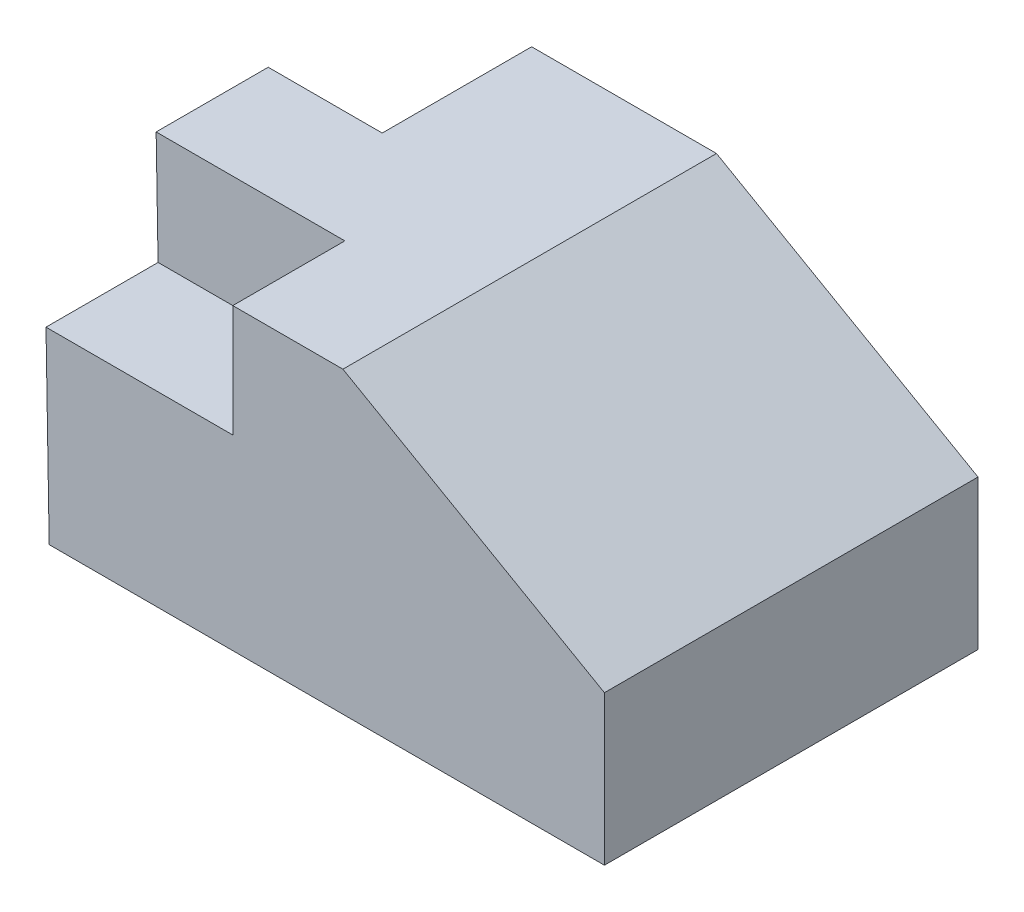
ISO-10303-21;
HEADER;
FILE_DESCRIPTION(('STEP AP214'),'2;1');
FILE_NAME('part.step','',(''),(''),'','','');
FILE_SCHEMA(('AUTOMOTIVE_DESIGN { 1 0 10303 214 1 1 1 1 }'));
ENDSEC;
DATA;
#1=APPLICATION_CONTEXT('core data for automotive mechanical design processes');
#2=APPLICATION_PROTOCOL_DEFINITION('international standard','automotive_design',2000,#1);
#3=PRODUCT_CONTEXT('',#1,'mechanical');
#4=PRODUCT('Part','Part','',(#3));
#5=PRODUCT_RELATED_PRODUCT_CATEGORY('part','',(#4));
#6=PRODUCT_DEFINITION_FORMATION('','',#4);
#7=PRODUCT_DEFINITION_CONTEXT('part definition',#1,'design');
#8=PRODUCT_DEFINITION('design','',#6,#7);
#9=PRODUCT_DEFINITION_SHAPE('','',#8);
#10=(LENGTH_UNIT() NAMED_UNIT(*) SI_UNIT(.MILLI.,.METRE.));
#11=(NAMED_UNIT(*) PLANE_ANGLE_UNIT() SI_UNIT($,.RADIAN.));
#12=(NAMED_UNIT(*) SI_UNIT($,.STERADIAN.) SOLID_ANGLE_UNIT());
#13=UNCERTAINTY_MEASURE_WITH_UNIT(LENGTH_MEASURE(1.E-05),#10,'distance_accuracy_value','');
#14=(GEOMETRIC_REPRESENTATION_CONTEXT(3) GLOBAL_UNCERTAINTY_ASSIGNED_CONTEXT((#13)) GLOBAL_UNIT_ASSIGNED_CONTEXT((#10,
#11,#12)) REPRESENTATION_CONTEXT('',''));
#15=CARTESIAN_POINT('',(0.,0.,0.));
#16=DIRECTION('',(0.,0.,1.));
#17=DIRECTION('',(1.,0.,0.));
#18=AXIS2_PLACEMENT_3D('',#15,#16,#17);
#19=CARTESIAN_POINT('',(1.37176158682331,0.,-100.));
#20=DIRECTION('',(0.,-1.,0.));
#21=DIRECTION('',(0.,0.,-1.));
#22=AXIS2_PLACEMENT_3D('',#19,#20,#21);
#23=PLANE('',#22);
#24=DIRECTION('',(1.,0.,0.));
#25=VECTOR('',#24,1.);
#26=CARTESIAN_POINT('',(0.514410595058741,0.,-60.));
#27=LINE('',#26,#25);
#28=CARTESIAN_POINT('',(1.37176158682331,0.,-60.));
#29=VERTEX_POINT('',#28);
#30=CARTESIAN_POINT('',(30.5144105950587,0.,-60.));
#31=VERTEX_POINT('',#30);
#32=EDGE_CURVE('E134',#29,#31,#27,.T.);
#33=ORIENTED_EDGE('',*,*,#32,.T.);
#34=DIRECTION('',(0.,0.,1.));
#35=VECTOR('',#34,1.);
#36=CARTESIAN_POINT('',(30.5144105950587,0.,-100.));
#37=LINE('',#36,#35);
#38=CARTESIAN_POINT('',(30.5144105950587,0.,-100.));
#39=VERTEX_POINT('',#38);
#40=EDGE_CURVE('E126',#39,#31,#37,.T.);
#41=ORIENTED_EDGE('',*,*,#40,.F.);
#42=DIRECTION('',(1.,0.,0.));
#43=VECTOR('',#42,1.);
#44=CARTESIAN_POINT('',(1.37176158682331,0.,-100.));
#45=LINE('',#44,#43);
#46=CARTESIAN_POINT('',(150.,0.,-100.));
#47=VERTEX_POINT('',#46);
#48=EDGE_CURVE('E137',#39,#47,#45,.T.);
#49=ORIENTED_EDGE('',*,*,#48,.T.);
#50=DIRECTION('',(0.,0.,1.));
#51=VECTOR('',#50,1.);
#52=CARTESIAN_POINT('',(150.,0.,-100.));
#53=LINE('',#52,#51);
#54=CARTESIAN_POINT('',(150.,0.,0.));
#55=VERTEX_POINT('',#54);
#56=EDGE_CURVE('E55',#47,#55,#53,.T.);
#57=ORIENTED_EDGE('',*,*,#56,.T.);
#58=DIRECTION('',(1.,0.,0.));
#59=VECTOR('',#58,1.);
#60=CARTESIAN_POINT('',(1.37176158682331,0.,0.));
#61=LINE('',#60,#59);
#62=CARTESIAN_POINT('',(1.37176158682331,0.,0.));
#63=VERTEX_POINT('',#62);
#64=EDGE_CURVE('E171',#63,#55,#61,.T.);
#65=ORIENTED_EDGE('',*,*,#64,.F.);
#66=DIRECTION('',(0.,0.,1.));
#67=VECTOR('',#66,1.);
#68=CARTESIAN_POINT('',(1.37176158682331,0.,-100.));
#69=LINE('',#68,#67);
#70=EDGE_CURVE('E181',#29,#63,#69,.T.);
#71=ORIENTED_EDGE('',*,*,#70,.F.);
#72=EDGE_LOOP('',(#33,#41,#49,#57,#65,#71));
#73=FACE_BOUND('',#72,.T.);
#74=ADVANCED_FACE('F45',(#73),#23,.T.);
#75=CARTESIAN_POINT('',(0.,0.,-100.));
#76=DIRECTION('',(0.,0.,-1.));
#77=DIRECTION('',(-1.,0.,0.));
#78=AXIS2_PLACEMENT_3D('',#75,#76,#77);
#79=PLANE('',#78);
#80=ORIENTED_EDGE('',*,*,#48,.F.);
#81=DIRECTION('',(0.,-1.,0.));
#82=VECTOR('',#81,1.);
#83=CARTESIAN_POINT('',(30.5144105950587,80.,-100.));
#84=LINE('',#83,#82);
#85=CARTESIAN_POINT('',(30.5144105950587,80.,-100.));
#86=VERTEX_POINT('',#85);
#87=EDGE_CURVE('E123',#86,#39,#84,.T.);
#88=ORIENTED_EDGE('',*,*,#87,.F.);
#89=DIRECTION('',(-1.,0.,0.));
#90=VECTOR('',#89,1.);
#91=CARTESIAN_POINT('',(80.,80.,-100.));
#92=LINE('',#91,#90);
#93=CARTESIAN_POINT('',(80.,80.,-100.));
#94=VERTEX_POINT('',#93);
#95=EDGE_CURVE('E149',#94,#86,#92,.T.);
#96=ORIENTED_EDGE('',*,*,#95,.F.);
#97=DIRECTION('',(-0.868243142124459,0.496138938356834,0.));
#98=VECTOR('',#97,1.);
#99=CARTESIAN_POINT('',(150.,40.,-100.));
#100=LINE('',#99,#98);
#101=CARTESIAN_POINT('',(150.,40.,-100.));
#102=VERTEX_POINT('',#101);
#103=EDGE_CURVE('E154',#102,#94,#100,.T.);
#104=ORIENTED_EDGE('',*,*,#103,.F.);
#105=DIRECTION('',(0.,1.,0.));
#106=VECTOR('',#105,1.);
#107=CARTESIAN_POINT('',(150.,0.,-100.));
#108=LINE('',#107,#106);
#109=EDGE_CURVE('E147',#47,#102,#108,.T.);
#110=ORIENTED_EDGE('',*,*,#109,.F.);
#111=EDGE_LOOP('',(#80,#88,#96,#104,#110));
#112=FACE_BOUND('',#111,.T.);
#113=ADVANCED_FACE('F144',(#112),#79,.T.);
#114=CARTESIAN_POINT('',(150.,40.,-100.));
#115=DIRECTION('',(0.496138938356834,0.868243142124459,0.));
#116=DIRECTION('',(-0.868243142124459,0.496138938356834,0.));
#117=AXIS2_PLACEMENT_3D('',#114,#115,#116);
#118=PLANE('',#117);
#119=DIRECTION('',(-0.868243142124459,0.496138938356834,0.));
#120=VECTOR('',#119,1.);
#121=CARTESIAN_POINT('',(150.,40.,0.));
#122=LINE('',#121,#120);
#123=CARTESIAN_POINT('',(150.,40.,0.));
#124=VERTEX_POINT('',#123);
#125=CARTESIAN_POINT('',(80.,80.,0.));
#126=VERTEX_POINT('',#125);
#127=EDGE_CURVE('E158',#124,#126,#122,.T.);
#128=ORIENTED_EDGE('',*,*,#127,.F.);
#129=DIRECTION('',(0.,0.,1.));
#130=VECTOR('',#129,1.);
#131=CARTESIAN_POINT('',(150.,40.,-100.));
#132=LINE('',#131,#130);
#133=EDGE_CURVE('E11',#102,#124,#132,.T.);
#134=ORIENTED_EDGE('',*,*,#133,.F.);
#135=ORIENTED_EDGE('',*,*,#103,.T.);
#136=DIRECTION('',(0.,0.,1.));
#137=VECTOR('',#136,1.);
#138=CARTESIAN_POINT('',(80.,80.,-100.));
#139=LINE('',#138,#137);
#140=EDGE_CURVE('E49',#94,#126,#139,.T.);
#141=ORIENTED_EDGE('',*,*,#140,.T.);
#142=EDGE_LOOP('',(#128,#134,#135,#141));
#143=FACE_BOUND('',#142,.T.);
#144=ADVANCED_FACE('F47',(#143),#118,.T.);
#145=CARTESIAN_POINT('',(150.,0.,-100.));
#146=DIRECTION('',(1.,0.,0.));
#147=DIRECTION('',(0.,0.,-1.));
#148=AXIS2_PLACEMENT_3D('',#145,#146,#147);
#149=PLANE('',#148);
#150=DIRECTION('',(0.,1.,0.));
#151=VECTOR('',#150,1.);
#152=CARTESIAN_POINT('',(150.,0.,0.));
#153=LINE('',#152,#151);
#154=EDGE_CURVE('E175',#55,#124,#153,.T.);
#155=ORIENTED_EDGE('',*,*,#154,.F.);
#156=ORIENTED_EDGE('',*,*,#56,.F.);
#157=ORIENTED_EDGE('',*,*,#109,.T.);
#158=ORIENTED_EDGE('',*,*,#133,.T.);
#159=EDGE_LOOP('',(#155,#156,#157,#158));
#160=FACE_BOUND('',#159,.T.);
#161=ADVANCED_FACE('F203',(#160),#149,.T.);
#162=CARTESIAN_POINT('',(0.,80.,-100.));
#163=DIRECTION('',(-0.999853022265417,-0.0171444996051612,0.));
#164=DIRECTION('',(0.0171444996051612,-0.999853022265417,0.));
#165=AXIS2_PLACEMENT_3D('',#162,#163,#164);
#166=PLANE('',#165);
#167=DIRECTION('',(-0.0171444996051611,0.999853022265417,0.));
#168=VECTOR('',#167,1.);
#169=CARTESIAN_POINT('',(0.514410595058741,50.,-60.));
#170=LINE('',#169,#168);
#171=CARTESIAN_POINT('',(0.,80.,-60.));
#172=VERTEX_POINT('',#171);
#173=EDGE_CURVE('E133',#29,#172,#170,.T.);
#174=ORIENTED_EDGE('',*,*,#173,.F.);
#175=ORIENTED_EDGE('',*,*,#70,.T.);
#176=DIRECTION('',(0.0171444996051612,-0.999853022265417,0.));
#177=VECTOR('',#176,1.);
#178=CARTESIAN_POINT('',(0.,80.,0.));
#179=LINE('',#178,#177);
#180=CARTESIAN_POINT('',(0.514410595058741,50.,0.));
#181=VERTEX_POINT('',#180);
#182=EDGE_CURVE('E167',#181,#63,#179,.T.);
#183=ORIENTED_EDGE('',*,*,#182,.F.);
#184=DIRECTION('',(0.,0.,1.));
#185=VECTOR('',#184,1.);
#186=CARTESIAN_POINT('',(0.514410595058741,50.,-30.));
#187=LINE('',#186,#185);
#188=CARTESIAN_POINT('',(0.514410595058741,50.,-30.));
#189=VERTEX_POINT('',#188);
#190=EDGE_CURVE('E71',#189,#181,#187,.T.);
#191=ORIENTED_EDGE('',*,*,#190,.F.);
#192=DIRECTION('',(0.0171444996051612,-0.999853022265417,0.));
#193=VECTOR('',#192,1.);
#194=CARTESIAN_POINT('',(0.,80.,-30.));
#195=LINE('',#194,#193);
#196=CARTESIAN_POINT('',(0.,80.,-30.));
#197=VERTEX_POINT('',#196);
#198=EDGE_CURVE('E228',#197,#189,#195,.T.);
#199=ORIENTED_EDGE('',*,*,#198,.F.);
#200=DIRECTION('',(0.,0.,1.));
#201=VECTOR('',#200,1.);
#202=CARTESIAN_POINT('',(0.,80.,-100.));
#203=LINE('',#202,#201);
#204=EDGE_CURVE('E183',#172,#197,#203,.T.);
#205=ORIENTED_EDGE('',*,*,#204,.F.);
#206=EDGE_LOOP('',(#174,#175,#183,#191,#199,#205));
#207=FACE_BOUND('',#206,.T.);
#208=ADVANCED_FACE('F250',(#207),#166,.T.);
#209=CARTESIAN_POINT('',(80.,80.,-100.));
#210=DIRECTION('',(0.,1.,0.));
#211=DIRECTION('',(-1.,0.,0.));
#212=AXIS2_PLACEMENT_3D('',#209,#210,#211);
#213=PLANE('',#212);
#214=DIRECTION('',(0.,0.,-1.));
#215=VECTOR('',#214,1.);
#216=CARTESIAN_POINT('',(30.5144105950587,80.,-60.));
#217=LINE('',#216,#215);
#218=CARTESIAN_POINT('',(30.5144105950587,80.,-60.));
#219=VERTEX_POINT('',#218);
#220=EDGE_CURVE('E63',#219,#86,#217,.T.);
#221=ORIENTED_EDGE('',*,*,#220,.F.);
#222=DIRECTION('',(1.,0.,0.));
#223=VECTOR('',#222,1.);
#224=CARTESIAN_POINT('',(0.,80.,-60.));
#225=LINE('',#224,#223);
#226=EDGE_CURVE('E239',#172,#219,#225,.T.);
#227=ORIENTED_EDGE('',*,*,#226,.F.);
#228=ORIENTED_EDGE('',*,*,#204,.T.);
#229=DIRECTION('',(-1.,0.,0.));
#230=VECTOR('',#229,1.);
#231=CARTESIAN_POINT('',(50.5144105950587,80.,-30.));
#232=LINE('',#231,#230);
#233=CARTESIAN_POINT('',(50.5144105950587,80.,-30.));
#234=VERTEX_POINT('',#233);
#235=EDGE_CURVE('E217',#234,#197,#232,.T.);
#236=ORIENTED_EDGE('',*,*,#235,.F.);
#237=DIRECTION('',(0.,0.,1.));
#238=VECTOR('',#237,1.);
#239=CARTESIAN_POINT('',(50.5144105950587,80.,-30.));
#240=LINE('',#239,#238);
#241=CARTESIAN_POINT('',(50.5144105950587,80.,0.));
#242=VERTEX_POINT('',#241);
#243=EDGE_CURVE('E163',#234,#242,#240,.T.);
#244=ORIENTED_EDGE('',*,*,#243,.T.);
#245=DIRECTION('',(-1.,0.,0.));
#246=VECTOR('',#245,1.);
#247=CARTESIAN_POINT('',(80.,80.,0.));
#248=LINE('',#247,#246);
#249=EDGE_CURVE('E162',#126,#242,#248,.T.);
#250=ORIENTED_EDGE('',*,*,#249,.F.);
#251=ORIENTED_EDGE('',*,*,#140,.F.);
#252=ORIENTED_EDGE('',*,*,#95,.T.);
#253=EDGE_LOOP('',(#221,#227,#228,#236,#244,#250,#251,#252));
#254=FACE_BOUND('',#253,.T.);
#255=ADVANCED_FACE('F196',(#254),#213,.T.);
#256=CARTESIAN_POINT('',(0.,0.,0.));
#257=DIRECTION('',(0.,0.,-1.));
#258=DIRECTION('',(-1.,0.,0.));
#259=AXIS2_PLACEMENT_3D('',#256,#257,#258);
#260=PLANE('',#259);
#261=ORIENTED_EDGE('',*,*,#249,.T.);
#262=DIRECTION('',(0.,1.,0.));
#263=VECTOR('',#262,1.);
#264=CARTESIAN_POINT('',(50.5144105950587,50.,0.));
#265=LINE('',#264,#263);
#266=CARTESIAN_POINT('',(50.5144105950587,50.,0.));
#267=VERTEX_POINT('',#266);
#268=EDGE_CURVE('E214',#267,#242,#265,.T.);
#269=ORIENTED_EDGE('',*,*,#268,.F.);
#270=DIRECTION('',(1.,0.,0.));
#271=VECTOR('',#270,1.);
#272=CARTESIAN_POINT('',(0.514410595058741,50.,0.));
#273=LINE('',#272,#271);
#274=EDGE_CURVE('E218',#181,#267,#273,.T.);
#275=ORIENTED_EDGE('',*,*,#274,.F.);
#276=ORIENTED_EDGE('',*,*,#182,.T.);
#277=ORIENTED_EDGE('',*,*,#64,.T.);
#278=ORIENTED_EDGE('',*,*,#154,.T.);
#279=ORIENTED_EDGE('',*,*,#127,.T.);
#280=EDGE_LOOP('',(#261,#269,#275,#276,#277,#278,#279));
#281=FACE_BOUND('',#280,.T.);
#282=ADVANCED_FACE('F199',(#281),#260,.F.);
#283=CARTESIAN_POINT('',(50.5144105950587,50.,-30.));
#284=DIRECTION('',(1.,0.,0.));
#285=DIRECTION('',(0.,0.,-1.));
#286=AXIS2_PLACEMENT_3D('',#283,#284,#285);
#287=PLANE('',#286);
#288=ORIENTED_EDGE('',*,*,#268,.T.);
#289=ORIENTED_EDGE('',*,*,#243,.F.);
#290=DIRECTION('',(0.,1.,0.));
#291=VECTOR('',#290,1.);
#292=CARTESIAN_POINT('',(50.5144105950587,50.,-30.));
#293=LINE('',#292,#291);
#294=CARTESIAN_POINT('',(50.5144105950587,50.,-30.));
#295=VERTEX_POINT('',#294);
#296=EDGE_CURVE('E209',#295,#234,#293,.T.);
#297=ORIENTED_EDGE('',*,*,#296,.F.);
#298=DIRECTION('',(0.,0.,1.));
#299=VECTOR('',#298,1.);
#300=CARTESIAN_POINT('',(50.5144105950587,50.,-30.));
#301=LINE('',#300,#299);
#302=EDGE_CURVE('E208',#295,#267,#301,.T.);
#303=ORIENTED_EDGE('',*,*,#302,.T.);
#304=EDGE_LOOP('',(#288,#289,#297,#303));
#305=FACE_BOUND('',#304,.T.);
#306=ADVANCED_FACE('F256',(#305),#287,.F.);
#307=CARTESIAN_POINT('',(0.514410595058741,50.,-30.));
#308=DIRECTION('',(0.,-1.,0.));
#309=DIRECTION('',(0.,0.,-1.));
#310=AXIS2_PLACEMENT_3D('',#307,#308,#309);
#311=PLANE('',#310);
#312=ORIENTED_EDGE('',*,*,#274,.T.);
#313=ORIENTED_EDGE('',*,*,#302,.F.);
#314=DIRECTION('',(1.,0.,0.));
#315=VECTOR('',#314,1.);
#316=CARTESIAN_POINT('',(0.514410595058741,50.,-30.));
#317=LINE('',#316,#315);
#318=EDGE_CURVE('E224',#189,#295,#317,.T.);
#319=ORIENTED_EDGE('',*,*,#318,.F.);
#320=ORIENTED_EDGE('',*,*,#190,.T.);
#321=EDGE_LOOP('',(#312,#313,#319,#320));
#322=FACE_BOUND('',#321,.T.);
#323=ADVANCED_FACE('F257',(#322),#311,.F.);
#324=CARTESIAN_POINT('',(0.,0.,-30.));
#325=DIRECTION('',(0.,0.,-1.));
#326=DIRECTION('',(-1.,0.,0.));
#327=AXIS2_PLACEMENT_3D('',#324,#325,#326);
#328=PLANE('',#327);
#329=ORIENTED_EDGE('',*,*,#235,.T.);
#330=ORIENTED_EDGE('',*,*,#198,.T.);
#331=ORIENTED_EDGE('',*,*,#318,.T.);
#332=ORIENTED_EDGE('',*,*,#296,.T.);
#333=EDGE_LOOP('',(#329,#330,#331,#332));
#334=FACE_BOUND('',#333,.T.);
#335=ADVANCED_FACE('F253',(#334),#328,.F.);
#336=CARTESIAN_POINT('',(30.5144105950587,80.,-60.));
#337=DIRECTION('',(1.,0.,0.));
#338=DIRECTION('',(0.,1.,0.));
#339=AXIS2_PLACEMENT_3D('',#336,#337,#338);
#340=PLANE('',#339);
#341=ORIENTED_EDGE('',*,*,#87,.T.);
#342=ORIENTED_EDGE('',*,*,#40,.T.);
#343=DIRECTION('',(0.,-1.,0.));
#344=VECTOR('',#343,1.);
#345=CARTESIAN_POINT('',(30.5144105950587,80.,-60.));
#346=LINE('',#345,#344);
#347=EDGE_CURVE('E235',#219,#31,#346,.T.);
#348=ORIENTED_EDGE('',*,*,#347,.F.);
#349=ORIENTED_EDGE('',*,*,#220,.T.);
#350=EDGE_LOOP('',(#341,#342,#348,#349));
#351=FACE_BOUND('',#350,.T.);
#352=ADVANCED_FACE('F125',(#351),#340,.F.);
#353=CARTESIAN_POINT('',(0.,0.,-60.));
#354=DIRECTION('',(0.,0.,-1.));
#355=DIRECTION('',(-1.,0.,0.));
#356=AXIS2_PLACEMENT_3D('',#353,#354,#355);
#357=PLANE('',#356);
#358=ORIENTED_EDGE('',*,*,#173,.T.);
#359=ORIENTED_EDGE('',*,*,#226,.T.);
#360=ORIENTED_EDGE('',*,*,#347,.T.);
#361=ORIENTED_EDGE('',*,*,#32,.F.);
#362=EDGE_LOOP('',(#358,#359,#360,#361));
#363=FACE_BOUND('',#362,.T.);
#364=ADVANCED_FACE('F247',(#363),#357,.T.);
#365=CLOSED_SHELL('',(#74,#113,#144,#161,#208,#255,#282,#306,#323,#335,#352,#364));
#366=MANIFOLD_SOLID_BREP('B2',#365);
#367=ADVANCED_BREP_SHAPE_REPRESENTATION('',(#18,#366),#14);
#368=SHAPE_DEFINITION_REPRESENTATION(#9,#367);
ENDSEC;
END-ISO-10303-21;
